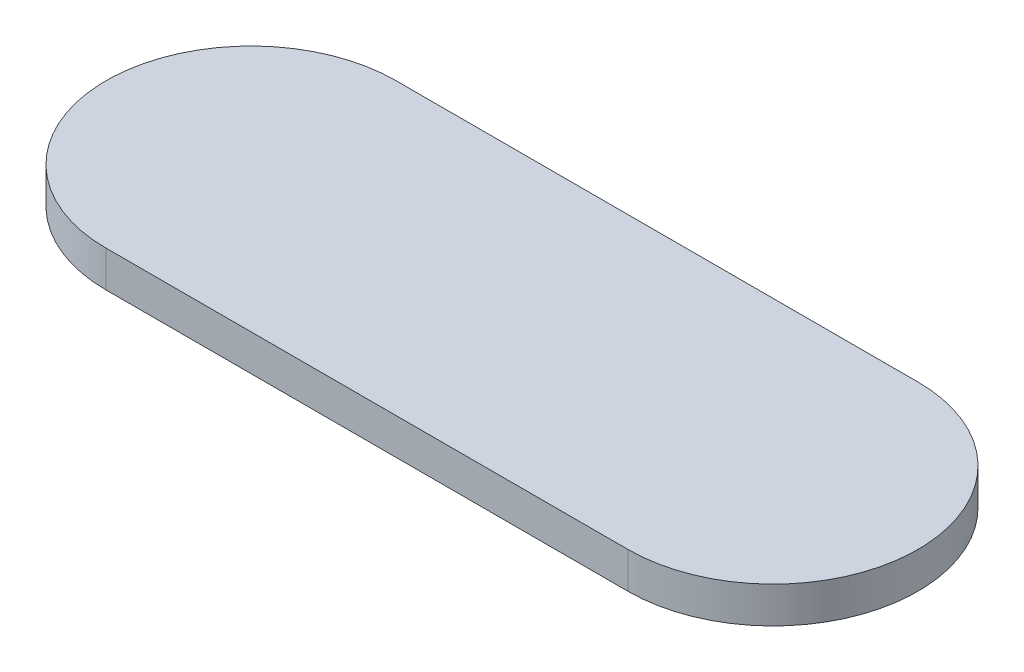
ISO-10303-21;
HEADER;
FILE_DESCRIPTION(('STEP AP214'),'2;1');
FILE_NAME('part.step','',(''),(''),'','','');
FILE_SCHEMA(('AUTOMOTIVE_DESIGN { 1 0 10303 214 1 1 1 1 }'));
ENDSEC;
DATA;
#1=APPLICATION_CONTEXT('core data for automotive mechanical design processes');
#2=APPLICATION_PROTOCOL_DEFINITION('international standard','automotive_design',2000,#1);
#3=PRODUCT_CONTEXT('',#1,'mechanical');
#4=PRODUCT('Part','Part','',(#3));
#5=PRODUCT_RELATED_PRODUCT_CATEGORY('part','',(#4));
#6=PRODUCT_DEFINITION_FORMATION('','',#4);
#7=PRODUCT_DEFINITION_CONTEXT('part definition',#1,'design');
#8=PRODUCT_DEFINITION('design','',#6,#7);
#9=PRODUCT_DEFINITION_SHAPE('','',#8);
#10=(LENGTH_UNIT() NAMED_UNIT(*) SI_UNIT(.MILLI.,.METRE.));
#11=(NAMED_UNIT(*) PLANE_ANGLE_UNIT() SI_UNIT($,.RADIAN.));
#12=(NAMED_UNIT(*) SI_UNIT($,.STERADIAN.) SOLID_ANGLE_UNIT());
#13=UNCERTAINTY_MEASURE_WITH_UNIT(LENGTH_MEASURE(1.E-05),#10,'distance_accuracy_value','');
#14=(GEOMETRIC_REPRESENTATION_CONTEXT(3) GLOBAL_UNCERTAINTY_ASSIGNED_CONTEXT((#13)) GLOBAL_UNIT_ASSIGNED_CONTEXT((#10,
#11,#12)) REPRESENTATION_CONTEXT('',''));
#15=CARTESIAN_POINT('',(0.,0.,0.));
#16=DIRECTION('',(0.,0.,1.));
#17=DIRECTION('',(1.,0.,0.));
#18=AXIS2_PLACEMENT_3D('',#15,#16,#17);
#19=CARTESIAN_POINT('',(-11.43,1.5875,0.));
#20=DIRECTION('',(0.,-1.,0.));
#21=DIRECTION('',(0.,0.,-1.));
#22=AXIS2_PLACEMENT_3D('',#19,#20,#21);
#23=CYLINDRICAL_SURFACE('',#22,6.35);
#24=CARTESIAN_POINT('',(-11.43,0.,0.));
#25=DIRECTION('',(0.,1.,0.));
#26=DIRECTION('',(0.,0.,1.));
#27=AXIS2_PLACEMENT_3D('',#24,#25,#26);
#28=CIRCLE('',#27,6.35);
#29=CARTESIAN_POINT('',(-11.43,0.,-6.35));
#30=VERTEX_POINT('',#29);
#31=CARTESIAN_POINT('',(-11.43,0.,6.35));
#32=VERTEX_POINT('',#31);
#33=EDGE_CURVE('E95',#30,#32,#28,.T.);
#34=ORIENTED_EDGE('',*,*,#33,.T.);
#35=DIRECTION('',(0.,-1.,0.));
#36=VECTOR('',#35,1.);
#37=CARTESIAN_POINT('',(-11.43,1.5875,6.35));
#38=LINE('',#37,#36);
#39=CARTESIAN_POINT('',(-11.43,1.5875,6.35));
#40=VERTEX_POINT('',#39);
#41=EDGE_CURVE('E11',#40,#32,#38,.T.);
#42=ORIENTED_EDGE('',*,*,#41,.F.);
#43=CARTESIAN_POINT('',(-11.43,1.5875,0.));
#44=DIRECTION('',(0.,1.,0.));
#45=DIRECTION('',(0.,0.,1.));
#46=AXIS2_PLACEMENT_3D('',#43,#44,#45);
#47=CIRCLE('',#46,6.35);
#48=CARTESIAN_POINT('',(-11.43,1.5875,-6.35));
#49=VERTEX_POINT('',#48);
#50=EDGE_CURVE('E83',#49,#40,#47,.T.);
#51=ORIENTED_EDGE('',*,*,#50,.F.);
#52=DIRECTION('',(0.,-1.,0.));
#53=VECTOR('',#52,1.);
#54=CARTESIAN_POINT('',(-11.43,1.5875,-6.35));
#55=LINE('',#54,#53);
#56=EDGE_CURVE('E91',#49,#30,#55,.T.);
#57=ORIENTED_EDGE('',*,*,#56,.T.);
#58=EDGE_LOOP('',(#34,#42,#51,#57));
#59=FACE_BOUND('',#58,.T.);
#60=ADVANCED_FACE('F32',(#59),#23,.T.);
#61=CARTESIAN_POINT('',(-11.43,1.5875,6.35));
#62=DIRECTION('',(0.,0.,-1.));
#63=DIRECTION('',(-1.,0.,0.));
#64=AXIS2_PLACEMENT_3D('',#61,#62,#63);
#65=PLANE('',#64);
#66=DIRECTION('',(1.,0.,0.));
#67=VECTOR('',#66,1.);
#68=CARTESIAN_POINT('',(-11.43,0.,6.35));
#69=LINE('',#68,#67);
#70=CARTESIAN_POINT('',(11.43,0.,6.35));
#71=VERTEX_POINT('',#70);
#72=EDGE_CURVE('E87',#32,#71,#69,.T.);
#73=ORIENTED_EDGE('',*,*,#72,.T.);
#74=DIRECTION('',(0.,-1.,0.));
#75=VECTOR('',#74,1.);
#76=CARTESIAN_POINT('',(11.43,1.5875,6.35));
#77=LINE('',#76,#75);
#78=CARTESIAN_POINT('',(11.43,1.5875,6.35));
#79=VERTEX_POINT('',#78);
#80=EDGE_CURVE('E40',#79,#71,#77,.T.);
#81=ORIENTED_EDGE('',*,*,#80,.F.);
#82=DIRECTION('',(1.,0.,0.));
#83=VECTOR('',#82,1.);
#84=CARTESIAN_POINT('',(-11.43,1.5875,6.35));
#85=LINE('',#84,#83);
#86=EDGE_CURVE('E78',#40,#79,#85,.T.);
#87=ORIENTED_EDGE('',*,*,#86,.F.);
#88=ORIENTED_EDGE('',*,*,#41,.T.);
#89=EDGE_LOOP('',(#73,#81,#87,#88));
#90=FACE_BOUND('',#89,.T.);
#91=ADVANCED_FACE('F86',(#90),#65,.F.);
#92=CARTESIAN_POINT('',(11.43,1.5875,0.));
#93=DIRECTION('',(0.,-1.,0.));
#94=DIRECTION('',(0.,0.,-1.));
#95=AXIS2_PLACEMENT_3D('',#92,#93,#94);
#96=CYLINDRICAL_SURFACE('',#95,6.35);
#97=CARTESIAN_POINT('',(11.43,0.,0.));
#98=DIRECTION('',(0.,1.,0.));
#99=DIRECTION('',(0.,0.,1.));
#100=AXIS2_PLACEMENT_3D('',#97,#98,#99);
#101=CIRCLE('',#100,6.35);
#102=CARTESIAN_POINT('',(11.43,0.,-6.35));
#103=VERTEX_POINT('',#102);
#104=EDGE_CURVE('E65',#71,#103,#101,.T.);
#105=ORIENTED_EDGE('',*,*,#104,.T.);
#106=DIRECTION('',(0.,-1.,0.));
#107=VECTOR('',#106,1.);
#108=CARTESIAN_POINT('',(11.43,1.5875,-6.35));
#109=LINE('',#108,#107);
#110=CARTESIAN_POINT('',(11.43,1.5875,-6.35));
#111=VERTEX_POINT('',#110);
#112=EDGE_CURVE('E88',#111,#103,#109,.T.);
#113=ORIENTED_EDGE('',*,*,#112,.F.);
#114=CARTESIAN_POINT('',(11.43,1.5875,0.));
#115=DIRECTION('',(0.,1.,0.));
#116=DIRECTION('',(0.,0.,1.));
#117=AXIS2_PLACEMENT_3D('',#114,#115,#116);
#118=CIRCLE('',#117,6.35);
#119=EDGE_CURVE('E81',#79,#111,#118,.T.);
#120=ORIENTED_EDGE('',*,*,#119,.F.);
#121=ORIENTED_EDGE('',*,*,#80,.T.);
#122=EDGE_LOOP('',(#105,#113,#120,#121));
#123=FACE_BOUND('',#122,.T.);
#124=ADVANCED_FACE('F89',(#123),#96,.T.);
#125=CARTESIAN_POINT('',(-11.43,1.5875,-6.35));
#126=DIRECTION('',(0.,0.,1.));
#127=DIRECTION('',(1.,0.,0.));
#128=AXIS2_PLACEMENT_3D('',#125,#126,#127);
#129=PLANE('',#128);
#130=DIRECTION('',(-1.,0.,0.));
#131=VECTOR('',#130,1.);
#132=CARTESIAN_POINT('',(-11.43,0.,-6.35));
#133=LINE('',#132,#131);
#134=EDGE_CURVE('E71',#103,#30,#133,.T.);
#135=ORIENTED_EDGE('',*,*,#134,.T.);
#136=ORIENTED_EDGE('',*,*,#56,.F.);
#137=DIRECTION('',(-1.,0.,0.));
#138=VECTOR('',#137,1.);
#139=CARTESIAN_POINT('',(-11.43,1.5875,-6.35));
#140=LINE('',#139,#138);
#141=EDGE_CURVE('E48',#111,#49,#140,.T.);
#142=ORIENTED_EDGE('',*,*,#141,.F.);
#143=ORIENTED_EDGE('',*,*,#112,.T.);
#144=EDGE_LOOP('',(#135,#136,#142,#143));
#145=FACE_BOUND('',#144,.T.);
#146=ADVANCED_FACE('F102',(#145),#129,.F.);
#147=CARTESIAN_POINT('',(-11.43,1.5875,0.));
#148=DIRECTION('',(0.,1.,0.));
#149=DIRECTION('',(0.,0.,1.));
#150=AXIS2_PLACEMENT_3D('',#147,#148,#149);
#151=PLANE('',#150);
#152=ORIENTED_EDGE('',*,*,#50,.T.);
#153=ORIENTED_EDGE('',*,*,#86,.T.);
#154=ORIENTED_EDGE('',*,*,#119,.T.);
#155=ORIENTED_EDGE('',*,*,#141,.T.);
#156=EDGE_LOOP('',(#152,#153,#154,#155));
#157=FACE_BOUND('',#156,.T.);
#158=ADVANCED_FACE('F79',(#157),#151,.T.);
#159=CARTESIAN_POINT('',(-11.43,0.,0.));
#160=DIRECTION('',(0.,1.,0.));
#161=DIRECTION('',(0.,0.,1.));
#162=AXIS2_PLACEMENT_3D('',#159,#160,#161);
#163=PLANE('',#162);
#164=ORIENTED_EDGE('',*,*,#33,.F.);
#165=ORIENTED_EDGE('',*,*,#134,.F.);
#166=ORIENTED_EDGE('',*,*,#104,.F.);
#167=ORIENTED_EDGE('',*,*,#72,.F.);
#168=EDGE_LOOP('',(#164,#165,#166,#167));
#169=FACE_BOUND('',#168,.T.);
#170=ADVANCED_FACE('F105',(#169),#163,.F.);
#171=CLOSED_SHELL('',(#60,#91,#124,#146,#158,#170));
#172=MANIFOLD_SOLID_BREP('B2',#171);
#173=ADVANCED_BREP_SHAPE_REPRESENTATION('',(#18,#172),#14);
#174=SHAPE_DEFINITION_REPRESENTATION(#9,#173);
ENDSEC;
END-ISO-10303-21;
